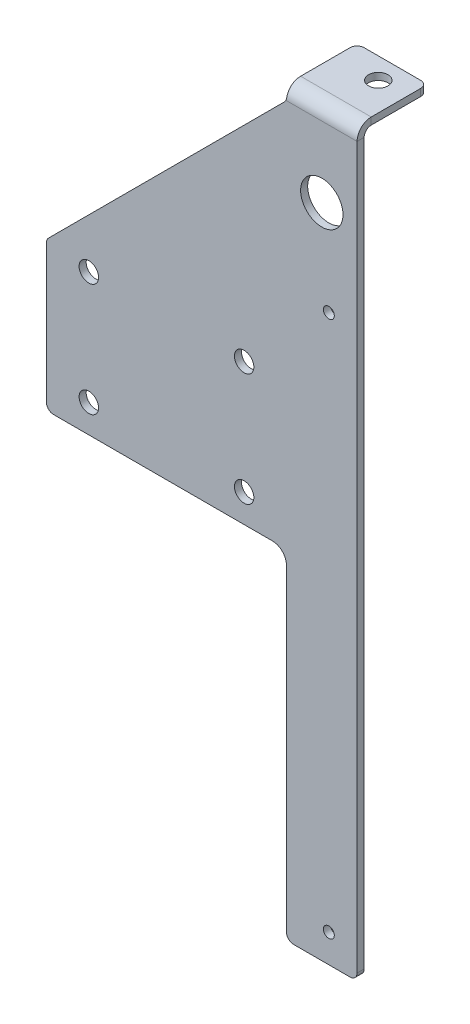
ISO-10303-21;
HEADER;
FILE_DESCRIPTION(('STEP AP214'),'2;1');
FILE_NAME('part.step','',(''),(''),'','','');
FILE_SCHEMA(('AUTOMOTIVE_DESIGN { 1 0 10303 214 1 1 1 1 }'));
ENDSEC;
DATA;
#1=APPLICATION_CONTEXT('core data for automotive mechanical design processes');
#2=APPLICATION_PROTOCOL_DEFINITION('international standard','automotive_design',2000,#1);
#3=PRODUCT_CONTEXT('',#1,'mechanical');
#4=PRODUCT('Part','Part','',(#3));
#5=PRODUCT_RELATED_PRODUCT_CATEGORY('part','',(#4));
#6=PRODUCT_DEFINITION_FORMATION('','',#4);
#7=PRODUCT_DEFINITION_CONTEXT('part definition',#1,'design');
#8=PRODUCT_DEFINITION('design','',#6,#7);
#9=PRODUCT_DEFINITION_SHAPE('','',#8);
#10=(LENGTH_UNIT() NAMED_UNIT(*) SI_UNIT(.MILLI.,.METRE.));
#11=(NAMED_UNIT(*) PLANE_ANGLE_UNIT() SI_UNIT($,.RADIAN.));
#12=(NAMED_UNIT(*) SI_UNIT($,.STERADIAN.) SOLID_ANGLE_UNIT());
#13=UNCERTAINTY_MEASURE_WITH_UNIT(LENGTH_MEASURE(1.E-05),#10,'distance_accuracy_value','');
#14=(GEOMETRIC_REPRESENTATION_CONTEXT(3) GLOBAL_UNCERTAINTY_ASSIGNED_CONTEXT((#13)) GLOBAL_UNIT_ASSIGNED_CONTEXT((#10,
#11,#12)) REPRESENTATION_CONTEXT('',''));
#15=CARTESIAN_POINT('',(0.,0.,0.));
#16=DIRECTION('',(0.,0.,1.));
#17=DIRECTION('',(1.,0.,0.));
#18=AXIS2_PLACEMENT_3D('',#15,#16,#17);
#19=CARTESIAN_POINT('',(31.75,0.,-6.35));
#20=DIRECTION('',(1.,0.,0.));
#21=DIRECTION('',(0.,0.,-1.));
#22=AXIS2_PLACEMENT_3D('',#19,#20,#21);
#23=PLANE('',#22);
#24=DIRECTION('',(0.,-1.,0.));
#25=VECTOR('',#24,1.);
#26=CARTESIAN_POINT('',(31.75,0.,-6.35));
#27=LINE('',#26,#25);
#28=CARTESIAN_POINT('',(31.75,0.,-6.35));
#29=VERTEX_POINT('',#28);
#30=CARTESIAN_POINT('',(31.75,-3.175,-6.35));
#31=VERTEX_POINT('',#30);
#32=EDGE_CURVE('E190',#29,#31,#27,.T.);
#33=ORIENTED_EDGE('',*,*,#32,.F.);
#34=CARTESIAN_POINT('',(31.75,-6.35,-6.35));
#35=DIRECTION('',(-1.,0.,0.));
#36=DIRECTION('',(0.,0.,1.));
#37=AXIS2_PLACEMENT_3D('',#34,#35,#36);
#38=CIRCLE('',#37,6.35);
#39=CARTESIAN_POINT('',(31.75,-6.35,0.));
#40=VERTEX_POINT('',#39);
#41=EDGE_CURVE('E185',#29,#40,#38,.F.);
#42=ORIENTED_EDGE('',*,*,#41,.T.);
#43=DIRECTION('',(0.,0.,1.));
#44=VECTOR('',#43,1.);
#45=CARTESIAN_POINT('',(31.75,-6.35,-3.175));
#46=LINE('',#45,#44);
#47=CARTESIAN_POINT('',(31.75,-6.35,-3.175));
#48=VERTEX_POINT('',#47);
#49=EDGE_CURVE('E181',#48,#40,#46,.T.);
#50=ORIENTED_EDGE('',*,*,#49,.F.);
#51=CARTESIAN_POINT('',(31.75,-6.35,-6.35));
#52=DIRECTION('',(1.,0.,0.));
#53=DIRECTION('',(0.,0.,-1.));
#54=AXIS2_PLACEMENT_3D('',#51,#52,#53);
#55=CIRCLE('',#54,3.175);
#56=EDGE_CURVE('E183',#31,#48,#55,.T.);
#57=ORIENTED_EDGE('',*,*,#56,.F.);
#58=EDGE_LOOP('',(#33,#42,#50,#57));
#59=FACE_BOUND('',#58,.T.);
#60=ADVANCED_FACE('F42',(#59),#23,.T.);
#61=CARTESIAN_POINT('',(31.75,-6.35,-3.175));
#62=DIRECTION('',(1.,0.,0.));
#63=DIRECTION('',(0.,0.,-1.));
#64=AXIS2_PLACEMENT_3D('',#61,#62,#63);
#65=PLANE('',#64);
#66=DIRECTION('',(0.,0.,1.));
#67=VECTOR('',#66,1.);
#68=CARTESIAN_POINT('',(31.75,-3.175,-31.75));
#69=LINE('',#68,#67);
#70=CARTESIAN_POINT('',(31.75,-3.175,-28.575));
#71=VERTEX_POINT('',#70);
#72=EDGE_CURVE('E217',#71,#31,#69,.T.);
#73=ORIENTED_EDGE('',*,*,#72,.F.);
#74=DIRECTION('',(0.,-1.,0.));
#75=VECTOR('',#74,1.);
#76=CARTESIAN_POINT('',(31.75,-6.35,-28.575));
#77=LINE('',#76,#75);
#78=CARTESIAN_POINT('',(31.75,0.,-28.575));
#79=VERTEX_POINT('',#78);
#80=EDGE_CURVE('E322',#71,#79,#77,.F.);
#81=ORIENTED_EDGE('',*,*,#80,.T.);
#82=DIRECTION('',(0.,0.,1.));
#83=VECTOR('',#82,1.);
#84=CARTESIAN_POINT('',(31.75,0.,-31.75));
#85=LINE('',#84,#83);
#86=EDGE_CURVE('E221',#79,#29,#85,.T.);
#87=ORIENTED_EDGE('',*,*,#86,.T.);
#88=ORIENTED_EDGE('',*,*,#32,.T.);
#89=EDGE_LOOP('',(#73,#81,#87,#88));
#90=FACE_BOUND('',#89,.T.);
#91=ADVANCED_FACE('F436',(#90),#65,.T.);
#92=CARTESIAN_POINT('',(0.,-6.35,0.));
#93=DIRECTION('',(-1.,0.,0.));
#94=DIRECTION('',(0.,0.,1.));
#95=AXIS2_PLACEMENT_3D('',#92,#93,#94);
#96=PLANE('',#95);
#97=CARTESIAN_POINT('',(0.,-6.35,-6.35));
#98=DIRECTION('',(1.,0.,0.));
#99=DIRECTION('',(0.,0.,-1.));
#100=AXIS2_PLACEMENT_3D('',#97,#98,#99);
#101=CIRCLE('',#100,3.175);
#102=CARTESIAN_POINT('',(0.,-3.175,-6.35));
#103=VERTEX_POINT('',#102);
#104=CARTESIAN_POINT('',(0.,-5.03487193946543,-3.46017938542985));
#105=VERTEX_POINT('',#104);
#106=EDGE_CURVE('E238',#103,#105,#101,.T.);
#107=ORIENTED_EDGE('',*,*,#106,.T.);
#108=DIRECTION('',(0.,0.,-1.));
#109=VECTOR('',#108,1.);
#110=CARTESIAN_POINT('',(0.,-5.03487193946543,0.));
#111=LINE('',#110,#109);
#112=CARTESIAN_POINT('',(0.,-5.03487193946543,-0.137678518911424));
#113=VERTEX_POINT('',#112);
#114=EDGE_CURVE('E343',#105,#113,#111,.F.);
#115=ORIENTED_EDGE('',*,*,#114,.T.);
#116=CARTESIAN_POINT('',(0.,-6.35,-6.35));
#117=DIRECTION('',(-1.,0.,0.));
#118=DIRECTION('',(0.,0.,1.));
#119=AXIS2_PLACEMENT_3D('',#116,#117,#118);
#120=CIRCLE('',#119,6.35);
#121=CARTESIAN_POINT('',(0.,0.,-6.35));
#122=VERTEX_POINT('',#121);
#123=EDGE_CURVE('E248',#122,#113,#120,.F.);
#124=ORIENTED_EDGE('',*,*,#123,.F.);
#125=DIRECTION('',(0.,1.,0.));
#126=VECTOR('',#125,1.);
#127=CARTESIAN_POINT('',(0.,-3.175,-6.35));
#128=LINE('',#127,#126);
#129=EDGE_CURVE('E191',#103,#122,#128,.T.);
#130=ORIENTED_EDGE('',*,*,#129,.F.);
#131=EDGE_LOOP('',(#107,#115,#124,#130));
#132=FACE_BOUND('',#131,.T.);
#133=ADVANCED_FACE('F432',(#132),#96,.T.);
#134=CARTESIAN_POINT('',(0.,-3.175,-6.35));
#135=DIRECTION('',(-1.,0.,0.));
#136=DIRECTION('',(0.,0.,1.));
#137=AXIS2_PLACEMENT_3D('',#134,#135,#136);
#138=PLANE('',#137);
#139=DIRECTION('',(0.,-1.,0.));
#140=VECTOR('',#139,1.);
#141=CARTESIAN_POINT('',(0.,0.,-3.175));
#142=LINE('',#141,#140);
#143=CARTESIAN_POINT('',(0.,-187.325,-3.17500000000002));
#144=VERTEX_POINT('',#143);
#145=CARTESIAN_POINT('',(0.,-330.2,-3.17500000000004));
#146=VERTEX_POINT('',#145);
#147=EDGE_CURVE('E233',#144,#146,#142,.T.);
#148=ORIENTED_EDGE('',*,*,#147,.T.);
#149=DIRECTION('',(0.,0.,1.));
#150=VECTOR('',#149,1.);
#151=CARTESIAN_POINT('',(0.,-330.2,-6.35));
#152=LINE('',#151,#150);
#153=CARTESIAN_POINT('',(0.,-330.2,0.));
#154=VERTEX_POINT('',#153);
#155=EDGE_CURVE('E379',#146,#154,#152,.T.);
#156=ORIENTED_EDGE('',*,*,#155,.T.);
#157=DIRECTION('',(0.,-1.,0.));
#158=VECTOR('',#157,1.);
#159=CARTESIAN_POINT('',(0.,0.,0.));
#160=LINE('',#159,#158);
#161=CARTESIAN_POINT('',(0.,-187.325,0.));
#162=VERTEX_POINT('',#161);
#163=EDGE_CURVE('E229',#162,#154,#160,.T.);
#164=ORIENTED_EDGE('',*,*,#163,.F.);
#165=DIRECTION('',(0.,0.,1.));
#166=VECTOR('',#165,1.);
#167=CARTESIAN_POINT('',(0.,-187.325,-3.17500000000004));
#168=LINE('',#167,#166);
#169=EDGE_CURVE('E299',#162,#144,#168,.F.);
#170=ORIENTED_EDGE('',*,*,#169,.T.);
#171=EDGE_LOOP('',(#148,#156,#164,#170));
#172=FACE_BOUND('',#171,.T.);
#173=ADVANCED_FACE('F428',(#172),#138,.T.);
#174=CARTESIAN_POINT('',(31.75,0.,0.));
#175=DIRECTION('',(0.,0.,-1.));
#176=DIRECTION('',(0.,1.,0.));
#177=AXIS2_PLACEMENT_3D('',#174,#175,#176);
#178=PLANE('',#177);
#179=CARTESIAN_POINT('',(15.875,-38.1,0.));
#180=DIRECTION('',(0.,0.,1.));
#181=DIRECTION('',(1.,0.,0.));
#182=AXIS2_PLACEMENT_3D('',#179,#180,#181);
#183=CIRCLE('',#182,9.525);
#184=CARTESIAN_POINT('',(25.4,-38.1,0.));
#185=VERTEX_POINT('',#184);
#186=EDGE_CURVE('E543',#185,#185,#183,.T.);
#187=ORIENTED_EDGE('',*,*,#186,.F.);
#188=EDGE_LOOP('',(#187));
#189=FACE_BOUND('',#188,.T.);
#190=CARTESIAN_POINT('',(19.05,-320.675,0.));
#191=DIRECTION('',(0.,0.,1.));
#192=DIRECTION('',(1.,0.,0.));
#193=AXIS2_PLACEMENT_3D('',#190,#191,#192);
#194=CIRCLE('',#193,2.45109999999999);
#195=CARTESIAN_POINT('',(21.5011,-320.675,0.));
#196=VERTEX_POINT('',#195);
#197=EDGE_CURVE('E542',#196,#196,#194,.T.);
#198=ORIENTED_EDGE('',*,*,#197,.F.);
#199=EDGE_LOOP('',(#198));
#200=FACE_BOUND('',#199,.T.);
#201=CARTESIAN_POINT('',(19.05,-79.375,0.));
#202=DIRECTION('',(0.,0.,1.));
#203=DIRECTION('',(1.,0.,0.));
#204=AXIS2_PLACEMENT_3D('',#201,#202,#203);
#205=CIRCLE('',#204,2.4511);
#206=CARTESIAN_POINT('',(21.5011,-79.375,0.));
#207=VERTEX_POINT('',#206);
#208=EDGE_CURVE('E287',#207,#207,#205,.T.);
#209=ORIENTED_EDGE('',*,*,#208,.F.);
#210=EDGE_LOOP('',(#209));
#211=FACE_BOUND('',#210,.T.);
#212=DIRECTION('',(-1.,0.,0.));
#213=VECTOR('',#212,1.);
#214=CARTESIAN_POINT('',(31.75,-333.375,0.));
#215=LINE('',#214,#213);
#216=CARTESIAN_POINT('',(28.575,-333.375,0.));
#217=VERTEX_POINT('',#216);
#218=CARTESIAN_POINT('',(3.175,-333.375,0.));
#219=VERTEX_POINT('',#218);
#220=EDGE_CURVE('E271',#217,#219,#215,.T.);
#221=ORIENTED_EDGE('',*,*,#220,.F.);
#222=CARTESIAN_POINT('',(28.575,-330.2,0.));
#223=DIRECTION('',(0.,0.,-1.));
#224=DIRECTION('',(0.,1.,0.));
#225=AXIS2_PLACEMENT_3D('',#222,#223,#224);
#226=CIRCLE('',#225,3.175);
#227=CARTESIAN_POINT('',(31.75,-330.2,0.));
#228=VERTEX_POINT('',#227);
#229=EDGE_CURVE('E362',#217,#228,#226,.F.);
#230=ORIENTED_EDGE('',*,*,#229,.T.);
#231=DIRECTION('',(0.,-1.,0.));
#232=VECTOR('',#231,1.);
#233=CARTESIAN_POINT('',(31.75,0.,0.));
#234=LINE('',#233,#232);
#235=EDGE_CURVE('E210',#40,#228,#234,.T.);
#236=ORIENTED_EDGE('',*,*,#235,.F.);
#237=DIRECTION('',(-1.,0.,0.));
#238=VECTOR('',#237,1.);
#239=CARTESIAN_POINT('',(31.75,-6.35,0.));
#240=LINE('',#239,#238);
#241=CARTESIAN_POINT('',(-0.285179385429851,-6.35,0.));
#242=VERTEX_POINT('',#241);
#243=EDGE_CURVE('E57',#40,#242,#240,.T.);
#244=ORIENTED_EDGE('',*,*,#243,.T.);
#245=CARTESIAN_POINT('',(-3.175,-5.03487193946543,0.));
#246=DIRECTION('',(0.,0.,-1.));
#247=DIRECTION('',(0.,1.,0.));
#248=AXIS2_PLACEMENT_3D('',#245,#246,#247);
#249=CIRCLE('',#248,3.175);
#250=CARTESIAN_POINT('',(-0.929935969732759,-7.27993596973274,0.));
#251=VERTEX_POINT('',#250);
#252=EDGE_CURVE('E11',#242,#251,#249,.T.);
#253=ORIENTED_EDGE('',*,*,#252,.T.);
#254=DIRECTION('',(-0.707106781186549,-0.707106781186546,0.));
#255=VECTOR('',#254,1.);
#256=CARTESIAN_POINT('',(-107.95,-114.3,0.));
#257=LINE('',#256,#255);
#258=CARTESIAN_POINT('',(-107.020064030267,-113.370064030267,0.));
#259=VERTEX_POINT('',#258);
#260=EDGE_CURVE('E583',#251,#259,#257,.T.);
#261=ORIENTED_EDGE('',*,*,#260,.T.);
#262=CARTESIAN_POINT('',(-104.775,-115.615128060534,0.));
#263=DIRECTION('',(0.,0.,-1.));
#264=DIRECTION('',(0.,1.,0.));
#265=AXIS2_PLACEMENT_3D('',#262,#263,#264);
#266=CIRCLE('',#265,3.175);
#267=CARTESIAN_POINT('',(-107.95,-115.615128060534,0.));
#268=VERTEX_POINT('',#267);
#269=EDGE_CURVE('E356',#259,#268,#266,.F.);
#270=ORIENTED_EDGE('',*,*,#269,.T.);
#271=DIRECTION('',(0.,-1.,0.));
#272=VECTOR('',#271,1.);
#273=CARTESIAN_POINT('',(-107.95,-180.975,0.));
#274=LINE('',#273,#272);
#275=CARTESIAN_POINT('',(-107.95,-177.8,0.));
#276=VERTEX_POINT('',#275);
#277=EDGE_CURVE('E598',#268,#276,#274,.T.);
#278=ORIENTED_EDGE('',*,*,#277,.T.);
#279=CARTESIAN_POINT('',(-104.775,-177.8,0.));
#280=DIRECTION('',(0.,0.,-1.));
#281=DIRECTION('',(0.,1.,0.));
#282=AXIS2_PLACEMENT_3D('',#279,#280,#281);
#283=CIRCLE('',#282,3.175);
#284=CARTESIAN_POINT('',(-104.775,-180.975,0.));
#285=VERTEX_POINT('',#284);
#286=EDGE_CURVE('E353',#276,#285,#283,.F.);
#287=ORIENTED_EDGE('',*,*,#286,.T.);
#288=DIRECTION('',(1.,0.,0.));
#289=VECTOR('',#288,1.);
#290=CARTESIAN_POINT('',(-107.95,-180.975,0.));
#291=LINE('',#290,#289);
#292=CARTESIAN_POINT('',(-6.34999999999999,-180.975,0.));
#293=VERTEX_POINT('',#292);
#294=EDGE_CURVE('E568',#285,#293,#291,.T.);
#295=ORIENTED_EDGE('',*,*,#294,.T.);
#296=CARTESIAN_POINT('',(-6.34999999999999,-187.325,0.));
#297=DIRECTION('',(0.,0.,-1.));
#298=DIRECTION('',(0.,1.,0.));
#299=AXIS2_PLACEMENT_3D('',#296,#297,#298);
#300=CIRCLE('',#299,6.35);
#301=EDGE_CURVE('E302',#293,#162,#300,.T.);
#302=ORIENTED_EDGE('',*,*,#301,.T.);
#303=ORIENTED_EDGE('',*,*,#163,.T.);
#304=CARTESIAN_POINT('',(3.175,-330.2,0.));
#305=DIRECTION('',(0.,0.,-1.));
#306=DIRECTION('',(0.,1.,0.));
#307=AXIS2_PLACEMENT_3D('',#304,#305,#306);
#308=CIRCLE('',#307,3.175);
#309=EDGE_CURVE('E359',#154,#219,#308,.F.);
#310=ORIENTED_EDGE('',*,*,#309,.T.);
#311=EDGE_LOOP('',(#221,#230,#236,#244,#253,#261,#270,#278,#287,#295,#302,#303,#310));
#312=FACE_BOUND('',#311,.T.);
#313=CARTESIAN_POINT('',(-19.05,-168.275,0.));
#314=DIRECTION('',(0.,0.,1.));
#315=DIRECTION('',(1.,0.,0.));
#316=AXIS2_PLACEMENT_3D('',#313,#314,#315);
#317=CIRCLE('',#316,4.3688);
#318=CARTESIAN_POINT('',(-14.6812,-168.275,0.));
#319=VERTEX_POINT('',#318);
#320=EDGE_CURVE('E579',#319,#319,#317,.T.);
#321=ORIENTED_EDGE('',*,*,#320,.F.);
#322=EDGE_LOOP('',(#321));
#323=FACE_BOUND('',#322,.T.);
#324=CARTESIAN_POINT('',(-88.9,-168.275,0.));
#325=DIRECTION('',(0.,0.,1.));
#326=DIRECTION('',(1.,0.,0.));
#327=AXIS2_PLACEMENT_3D('',#324,#325,#326);
#328=CIRCLE('',#327,4.36880000000001);
#329=CARTESIAN_POINT('',(-84.5312,-168.275,0.));
#330=VERTEX_POINT('',#329);
#331=EDGE_CURVE('E584',#330,#330,#328,.T.);
#332=ORIENTED_EDGE('',*,*,#331,.F.);
#333=EDGE_LOOP('',(#332));
#334=FACE_BOUND('',#333,.T.);
#335=CARTESIAN_POINT('',(-19.05,-117.475,0.));
#336=DIRECTION('',(0.,0.,1.));
#337=DIRECTION('',(1.,0.,0.));
#338=AXIS2_PLACEMENT_3D('',#335,#336,#337);
#339=CIRCLE('',#338,4.3688);
#340=CARTESIAN_POINT('',(-14.6812,-117.475,0.));
#341=VERTEX_POINT('',#340);
#342=EDGE_CURVE('E588',#341,#341,#339,.T.);
#343=ORIENTED_EDGE('',*,*,#342,.F.);
#344=EDGE_LOOP('',(#343));
#345=FACE_BOUND('',#344,.T.);
#346=CARTESIAN_POINT('',(-88.9,-117.475,0.));
#347=DIRECTION('',(0.,0.,1.));
#348=DIRECTION('',(1.,0.,0.));
#349=AXIS2_PLACEMENT_3D('',#346,#347,#348);
#350=CIRCLE('',#349,4.36880000000001);
#351=CARTESIAN_POINT('',(-84.5312,-117.475,0.));
#352=VERTEX_POINT('',#351);
#353=EDGE_CURVE('E562',#352,#352,#350,.T.);
#354=ORIENTED_EDGE('',*,*,#353,.F.);
#355=EDGE_LOOP('',(#354));
#356=FACE_BOUND('',#355,.T.);
#357=ADVANCED_FACE('F424',(#189,#200,#211,#312,#323,#334,#345,#356),#178,.F.);
#358=CARTESIAN_POINT('',(31.75,-333.375,-3.17500000000004));
#359=DIRECTION('',(0.,-1.,0.));
#360=DIRECTION('',(0.,0.,-1.));
#361=AXIS2_PLACEMENT_3D('',#358,#359,#360);
#362=PLANE('',#361);
#363=DIRECTION('',(-1.,0.,0.));
#364=VECTOR('',#363,1.);
#365=CARTESIAN_POINT('',(31.75,-333.375,-3.17500000000004));
#366=LINE('',#365,#364);
#367=CARTESIAN_POINT('',(28.575,-333.375,-3.17500000000004));
#368=VERTEX_POINT('',#367);
#369=CARTESIAN_POINT('',(3.175,-333.375,-3.17500000000004));
#370=VERTEX_POINT('',#369);
#371=EDGE_CURVE('E203',#368,#370,#366,.T.);
#372=ORIENTED_EDGE('',*,*,#371,.F.);
#373=DIRECTION('',(0.,0.,1.));
#374=VECTOR('',#373,1.);
#375=CARTESIAN_POINT('',(28.575,-333.375,-3.17500000000004));
#376=LINE('',#375,#374);
#377=EDGE_CURVE('E349',#368,#217,#376,.T.);
#378=ORIENTED_EDGE('',*,*,#377,.T.);
#379=ORIENTED_EDGE('',*,*,#220,.T.);
#380=DIRECTION('',(0.,0.,1.));
#381=VECTOR('',#380,1.);
#382=CARTESIAN_POINT('',(3.175,-333.375,-3.17500000000004));
#383=LINE('',#382,#381);
#384=EDGE_CURVE('E346',#219,#370,#383,.F.);
#385=ORIENTED_EDGE('',*,*,#384,.T.);
#386=EDGE_LOOP('',(#372,#378,#379,#385));
#387=FACE_BOUND('',#386,.T.);
#388=ADVANCED_FACE('F420',(#387),#362,.T.);
#389=CARTESIAN_POINT('',(31.75,0.,-3.175));
#390=DIRECTION('',(0.,0.,-1.));
#391=DIRECTION('',(0.,1.,0.));
#392=AXIS2_PLACEMENT_3D('',#389,#390,#391);
#393=PLANE('',#392);
#394=CARTESIAN_POINT('',(15.875,-38.1,-3.175));
#395=DIRECTION('',(0.,0.,-1.));
#396=DIRECTION('',(0.,1.,0.));
#397=AXIS2_PLACEMENT_3D('',#394,#395,#396);
#398=CIRCLE('',#397,9.525);
#399=CARTESIAN_POINT('',(15.875,-28.575,-3.175));
#400=VERTEX_POINT('',#399);
#401=EDGE_CURVE('E291',#400,#400,#398,.T.);
#402=ORIENTED_EDGE('',*,*,#401,.F.);
#403=EDGE_LOOP('',(#402));
#404=FACE_BOUND('',#403,.T.);
#405=CARTESIAN_POINT('',(19.05,-320.675,-3.17500000000004));
#406=DIRECTION('',(0.,0.,-1.));
#407=DIRECTION('',(0.,1.,0.));
#408=AXIS2_PLACEMENT_3D('',#405,#406,#407);
#409=CIRCLE('',#408,2.45109999999999);
#410=CARTESIAN_POINT('',(19.05,-318.2239,-3.17500000000004));
#411=VERTEX_POINT('',#410);
#412=EDGE_CURVE('E286',#411,#411,#409,.T.);
#413=ORIENTED_EDGE('',*,*,#412,.F.);
#414=EDGE_LOOP('',(#413));
#415=FACE_BOUND('',#414,.T.);
#416=CARTESIAN_POINT('',(19.05,-79.375,-3.17500000000001));
#417=DIRECTION('',(0.,0.,-1.));
#418=DIRECTION('',(0.,1.,0.));
#419=AXIS2_PLACEMENT_3D('',#416,#417,#418);
#420=CIRCLE('',#419,2.4511);
#421=CARTESIAN_POINT('',(19.05,-76.9239,-3.17500000000001));
#422=VERTEX_POINT('',#421);
#423=EDGE_CURVE('E282',#422,#422,#420,.T.);
#424=ORIENTED_EDGE('',*,*,#423,.F.);
#425=EDGE_LOOP('',(#424));
#426=FACE_BOUND('',#425,.T.);
#427=DIRECTION('',(0.,-1.,0.));
#428=VECTOR('',#427,1.);
#429=CARTESIAN_POINT('',(31.75,0.,-3.175));
#430=LINE('',#429,#428);
#431=CARTESIAN_POINT('',(31.75,-330.2,-3.17500000000004));
#432=VERTEX_POINT('',#431);
#433=EDGE_CURVE('E197',#48,#432,#430,.T.);
#434=ORIENTED_EDGE('',*,*,#433,.T.);
#435=CARTESIAN_POINT('',(28.575,-330.2,-3.17500000000004));
#436=DIRECTION('',(0.,0.,-1.));
#437=DIRECTION('',(0.,1.,0.));
#438=AXIS2_PLACEMENT_3D('',#435,#436,#437);
#439=CIRCLE('',#438,3.175);
#440=EDGE_CURVE('E376',#432,#368,#439,.T.);
#441=ORIENTED_EDGE('',*,*,#440,.T.);
#442=ORIENTED_EDGE('',*,*,#371,.T.);
#443=CARTESIAN_POINT('',(3.175,-330.2,-3.17500000000004));
#444=DIRECTION('',(0.,0.,-1.));
#445=DIRECTION('',(0.,1.,0.));
#446=AXIS2_PLACEMENT_3D('',#443,#444,#445);
#447=CIRCLE('',#446,3.175);
#448=EDGE_CURVE('E373',#370,#146,#447,.T.);
#449=ORIENTED_EDGE('',*,*,#448,.T.);
#450=ORIENTED_EDGE('',*,*,#147,.F.);
#451=CARTESIAN_POINT('',(-6.34999999999999,-187.325,-3.17500000000004));
#452=DIRECTION('',(0.,0.,-1.));
#453=DIRECTION('',(0.,1.,0.));
#454=AXIS2_PLACEMENT_3D('',#451,#452,#453);
#455=CIRCLE('',#454,6.35);
#456=CARTESIAN_POINT('',(-6.34999999999999,-180.975,-3.17500000000004));
#457=VERTEX_POINT('',#456);
#458=EDGE_CURVE('E305',#144,#457,#455,.F.);
#459=ORIENTED_EDGE('',*,*,#458,.T.);
#460=DIRECTION('',(1.,0.,0.));
#461=VECTOR('',#460,1.);
#462=CARTESIAN_POINT('',(-107.95,-180.975,-3.17500000000004));
#463=LINE('',#462,#461);
#464=CARTESIAN_POINT('',(-104.775,-180.975,-3.17500000000004));
#465=VERTEX_POINT('',#464);
#466=EDGE_CURVE('E556',#465,#457,#463,.T.);
#467=ORIENTED_EDGE('',*,*,#466,.F.);
#468=CARTESIAN_POINT('',(-104.775,-177.8,-3.17500000000004));
#469=DIRECTION('',(0.,0.,-1.));
#470=DIRECTION('',(0.,1.,0.));
#471=AXIS2_PLACEMENT_3D('',#468,#469,#470);
#472=CIRCLE('',#471,3.175);
#473=CARTESIAN_POINT('',(-107.95,-177.8,-3.17500000000004));
#474=VERTEX_POINT('',#473);
#475=EDGE_CURVE('E367',#465,#474,#472,.T.);
#476=ORIENTED_EDGE('',*,*,#475,.T.);
#477=DIRECTION('',(0.,-1.,0.));
#478=VECTOR('',#477,1.);
#479=CARTESIAN_POINT('',(-107.95,-180.975,-3.17500000000004));
#480=LINE('',#479,#478);
#481=CARTESIAN_POINT('',(-107.95,-115.615128060534,-3.17500000000003));
#482=VERTEX_POINT('',#481);
#483=EDGE_CURVE('E551',#482,#474,#480,.T.);
#484=ORIENTED_EDGE('',*,*,#483,.F.);
#485=CARTESIAN_POINT('',(-104.775,-115.615128060534,-3.17500000000004));
#486=DIRECTION('',(0.,0.,-1.));
#487=DIRECTION('',(0.,1.,0.));
#488=AXIS2_PLACEMENT_3D('',#485,#486,#487);
#489=CIRCLE('',#488,3.175);
#490=CARTESIAN_POINT('',(-107.020064030267,-113.370064030267,-3.17500000000004));
#491=VERTEX_POINT('',#490);
#492=EDGE_CURVE('E370',#482,#491,#489,.T.);
#493=ORIENTED_EDGE('',*,*,#492,.T.);
#494=DIRECTION('',(-0.707106781186549,-0.707106781186546,0.));
#495=VECTOR('',#494,1.);
#496=CARTESIAN_POINT('',(-107.95,-114.3,-3.17500000000004));
#497=LINE('',#496,#495);
#498=CARTESIAN_POINT('',(-0.929935969732718,-7.27993596973273,-3.17500000000003));
#499=VERTEX_POINT('',#498);
#500=EDGE_CURVE('E555',#499,#491,#497,.T.);
#501=ORIENTED_EDGE('',*,*,#500,.F.);
#502=CARTESIAN_POINT('',(-3.175,-5.03487193946543,-3.17500000000001));
#503=DIRECTION('',(0.,0.,-1.));
#504=DIRECTION('',(0.,1.,0.));
#505=AXIS2_PLACEMENT_3D('',#502,#503,#504);
#506=CIRCLE('',#505,3.175);
#507=CARTESIAN_POINT('',(-0.285179385429851,-6.35,-3.175));
#508=VERTEX_POINT('',#507);
#509=EDGE_CURVE('E200',#499,#508,#506,.F.);
#510=ORIENTED_EDGE('',*,*,#509,.T.);
#511=DIRECTION('',(-1.,0.,0.));
#512=VECTOR('',#511,1.);
#513=CARTESIAN_POINT('',(31.75,-6.35,-3.175));
#514=LINE('',#513,#512);
#515=EDGE_CURVE('E65',#48,#508,#514,.T.);
#516=ORIENTED_EDGE('',*,*,#515,.F.);
#517=EDGE_LOOP('',(#434,#441,#442,#449,#450,#459,#467,#476,#484,#493,#501,#510,#516));
#518=FACE_BOUND('',#517,.T.);
#519=CARTESIAN_POINT('',(-19.05,-117.475,-3.17500000000004));
#520=DIRECTION('',(0.,0.,-1.));
#521=DIRECTION('',(0.,1.,0.));
#522=AXIS2_PLACEMENT_3D('',#519,#520,#521);
#523=CIRCLE('',#522,4.3688);
#524=CARTESIAN_POINT('',(-19.05,-113.1062,-3.17500000000004));
#525=VERTEX_POINT('',#524);
#526=EDGE_CURVE('E563',#525,#525,#523,.F.);
#527=ORIENTED_EDGE('',*,*,#526,.T.);
#528=EDGE_LOOP('',(#527));
#529=FACE_BOUND('',#528,.T.);
#530=CARTESIAN_POINT('',(-19.05,-168.275,-3.17500000000004));
#531=DIRECTION('',(0.,0.,-1.));
#532=DIRECTION('',(0.,1.,0.));
#533=AXIS2_PLACEMENT_3D('',#530,#531,#532);
#534=CIRCLE('',#533,4.3688);
#535=CARTESIAN_POINT('',(-19.05,-163.9062,-3.17500000000004));
#536=VERTEX_POINT('',#535);
#537=EDGE_CURVE('E567',#536,#536,#534,.F.);
#538=ORIENTED_EDGE('',*,*,#537,.T.);
#539=EDGE_LOOP('',(#538));
#540=FACE_BOUND('',#539,.T.);
#541=CARTESIAN_POINT('',(-88.9,-168.275,-3.17500000000004));
#542=DIRECTION('',(0.,0.,-1.));
#543=DIRECTION('',(0.,1.,0.));
#544=AXIS2_PLACEMENT_3D('',#541,#542,#543);
#545=CIRCLE('',#544,4.36880000000001);
#546=CARTESIAN_POINT('',(-88.9,-163.9062,-3.17500000000004));
#547=VERTEX_POINT('',#546);
#548=EDGE_CURVE('E572',#547,#547,#545,.F.);
#549=ORIENTED_EDGE('',*,*,#548,.T.);
#550=EDGE_LOOP('',(#549));
#551=FACE_BOUND('',#550,.T.);
#552=CARTESIAN_POINT('',(-88.9,-117.475,-3.17500000000004));
#553=DIRECTION('',(0.,0.,-1.));
#554=DIRECTION('',(0.,1.,0.));
#555=AXIS2_PLACEMENT_3D('',#552,#553,#554);
#556=CIRCLE('',#555,4.36880000000001);
#557=CARTESIAN_POINT('',(-88.9,-113.1062,-3.17500000000004));
#558=VERTEX_POINT('',#557);
#559=EDGE_CURVE('E547',#558,#558,#556,.F.);
#560=ORIENTED_EDGE('',*,*,#559,.T.);
#561=EDGE_LOOP('',(#560));
#562=FACE_BOUND('',#561,.T.);
#563=ADVANCED_FACE('F195',(#404,#415,#426,#518,#529,#540,#551,#562),#393,.T.);
#564=CARTESIAN_POINT('',(31.75,-6.35,-6.35));
#565=DIRECTION('',(-1.,0.,0.));
#566=DIRECTION('',(0.,0.,1.));
#567=AXIS2_PLACEMENT_3D('',#564,#565,#566);
#568=CYLINDRICAL_SURFACE('',#567,3.175);
#569=ORIENTED_EDGE('',*,*,#106,.F.);
#570=DIRECTION('',(-1.,0.,0.));
#571=VECTOR('',#570,1.);
#572=CARTESIAN_POINT('',(31.75,-3.175,-6.35));
#573=LINE('',#572,#571);
#574=EDGE_CURVE('E204',#31,#103,#573,.T.);
#575=ORIENTED_EDGE('',*,*,#574,.F.);
#576=ORIENTED_EDGE('',*,*,#56,.T.);
#577=ORIENTED_EDGE('',*,*,#515,.T.);
#578=CARTESIAN_POINT('',(-0.28517938542985,-6.35,-3.175));
#579=CARTESIAN_POINT('',(-0.257515589266576,-6.28924424737698,-3.17498851669006));
#580=CARTESIAN_POINT('',(-0.231787087807921,-6.22759533212525,-3.17674375477549));
#581=CARTESIAN_POINT('',(-0.18431326261078,-6.10297470846146,-3.18401169265267));
#582=CARTESIAN_POINT('',(-0.162569410744313,-6.04000252078731,-3.18952577737252));
#583=CARTESIAN_POINT('',(-0.12368944960743,-5.9148264866102,-3.20434842258155));
#584=CARTESIAN_POINT('',(-0.106451869260069,-5.85264269966674,-3.21355882810916));
#585=CARTESIAN_POINT('',(-0.0759262594201792,-5.72804143293217,-3.23587063901319));
#586=CARTESIAN_POINT('',(-0.0626368272060468,-5.66562404413659,-3.2489706591488));
#587=CARTESIAN_POINT('',(-0.0339094327120363,-5.50772425205523,-3.28718417310493));
#588=CARTESIAN_POINT('',(-0.0211106821848284,-5.41237536115976,-3.314977810013));
#589=CARTESIAN_POINT('',(-0.00837010650018619,-5.27027585165398,-3.36379680027782));
#590=CARTESIAN_POINT('',(-0.00520139413403253,-5.22260161870243,-3.38146706289946));
#591=CARTESIAN_POINT('',(-0.0010161554027845,-5.12807681087783,-3.41911024000953));
#592=CARTESIAN_POINT('',(4.80953004608709E-07,-5.08122619403186,-3.43908303676246));
#593=CARTESIAN_POINT('',(0.,-5.03487193946543,-3.46017938542985));
#594=B_SPLINE_CURVE_WITH_KNOTS('',3,(#578,#579,#580,#581,#582,#583,#584,#585,#586,#587,#588,
#589,#590,#591,#592,#593),.UNSPECIFIED.,.F.,.F.,(4,2,2,2,2,2,2,4),(0.,0.200231203066913,
0.400536220214967,0.595841153475651,0.791076614425018,1.09051861001913,1.24325893663439,
1.39599145663863),.UNSPECIFIED.);
#595=EDGE_CURVE('E395',#508,#105,#594,.T.);
#596=ORIENTED_EDGE('',*,*,#595,.T.);
#597=EDGE_LOOP('',(#569,#575,#576,#577,#596));
#598=FACE_BOUND('',#597,.T.);
#599=ADVANCED_FACE('F214',(#598),#568,.F.);
#600=CARTESIAN_POINT('',(31.75,-3.175,-31.75));
#601=DIRECTION('',(0.,-1.,0.));
#602=DIRECTION('',(0.,0.,-1.));
#603=AXIS2_PLACEMENT_3D('',#600,#601,#602);
#604=PLANE('',#603);
#605=CARTESIAN_POINT('',(19.05,-3.17499999999998,-22.225));
#606=DIRECTION('',(0.,-1.,0.));
#607=DIRECTION('',(0.,0.,-1.));
#608=AXIS2_PLACEMENT_3D('',#605,#606,#607);
#609=CIRCLE('',#608,4.3688);
#610=CARTESIAN_POINT('',(19.05,-3.17499999999998,-26.5938));
#611=VERTEX_POINT('',#610);
#612=EDGE_CURVE('E234',#611,#611,#609,.T.);
#613=ORIENTED_EDGE('',*,*,#612,.F.);
#614=EDGE_LOOP('',(#613));
#615=FACE_BOUND('',#614,.T.);
#616=DIRECTION('',(-1.,0.,0.));
#617=VECTOR('',#616,1.);
#618=CARTESIAN_POINT('',(31.75,-3.175,-31.75));
#619=LINE('',#618,#617);
#620=CARTESIAN_POINT('',(28.575,-3.175,-31.75));
#621=VERTEX_POINT('',#620);
#622=CARTESIAN_POINT('',(3.175,-3.175,-31.75));
#623=VERTEX_POINT('',#622);
#624=EDGE_CURVE('E262',#621,#623,#619,.T.);
#625=ORIENTED_EDGE('',*,*,#624,.F.);
#626=CARTESIAN_POINT('',(28.575,-3.175,-28.575));
#627=DIRECTION('',(0.,-1.,0.));
#628=DIRECTION('',(0.,0.,-1.));
#629=AXIS2_PLACEMENT_3D('',#626,#627,#628);
#630=CIRCLE('',#629,3.175);
#631=EDGE_CURVE('E319',#621,#71,#630,.T.);
#632=ORIENTED_EDGE('',*,*,#631,.T.);
#633=ORIENTED_EDGE('',*,*,#72,.T.);
#634=ORIENTED_EDGE('',*,*,#574,.T.);
#635=DIRECTION('',(0.,0.,1.));
#636=VECTOR('',#635,1.);
#637=CARTESIAN_POINT('',(0.,-3.175,-31.75));
#638=LINE('',#637,#636);
#639=CARTESIAN_POINT('',(0.,-3.175,-28.575));
#640=VERTEX_POINT('',#639);
#641=EDGE_CURVE('E242',#640,#103,#638,.T.);
#642=ORIENTED_EDGE('',*,*,#641,.F.);
#643=CARTESIAN_POINT('',(3.175,-3.175,-28.575));
#644=DIRECTION('',(0.,-1.,0.));
#645=DIRECTION('',(0.,0.,-1.));
#646=AXIS2_PLACEMENT_3D('',#643,#644,#645);
#647=CIRCLE('',#646,3.175);
#648=EDGE_CURVE('E316',#640,#623,#647,.T.);
#649=ORIENTED_EDGE('',*,*,#648,.T.);
#650=EDGE_LOOP('',(#625,#632,#633,#634,#642,#649));
#651=FACE_BOUND('',#650,.T.);
#652=ADVANCED_FACE('F416',(#615,#651),#604,.T.);
#653=CARTESIAN_POINT('',(31.75,0.,-31.75));
#654=DIRECTION('',(0.,0.,-1.));
#655=DIRECTION('',(-1.,0.,0.));
#656=AXIS2_PLACEMENT_3D('',#653,#654,#655);
#657=PLANE('',#656);
#658=DIRECTION('',(-1.,0.,0.));
#659=VECTOR('',#658,1.);
#660=CARTESIAN_POINT('',(31.75,0.,-31.75));
#661=LINE('',#660,#659);
#662=CARTESIAN_POINT('',(28.575,0.,-31.75));
#663=VERTEX_POINT('',#662);
#664=CARTESIAN_POINT('',(3.175,0.,-31.75));
#665=VERTEX_POINT('',#664);
#666=EDGE_CURVE('E258',#663,#665,#661,.T.);
#667=ORIENTED_EDGE('',*,*,#666,.F.);
#668=DIRECTION('',(0.,-1.,0.));
#669=VECTOR('',#668,1.);
#670=CARTESIAN_POINT('',(28.575,0.,-31.75));
#671=LINE('',#670,#669);
#672=EDGE_CURVE('E312',#663,#621,#671,.T.);
#673=ORIENTED_EDGE('',*,*,#672,.T.);
#674=ORIENTED_EDGE('',*,*,#624,.T.);
#675=DIRECTION('',(0.,-1.,0.));
#676=VECTOR('',#675,1.);
#677=CARTESIAN_POINT('',(3.175,0.,-31.75));
#678=LINE('',#677,#676);
#679=EDGE_CURVE('E309',#623,#665,#678,.F.);
#680=ORIENTED_EDGE('',*,*,#679,.T.);
#681=EDGE_LOOP('',(#667,#673,#674,#680));
#682=FACE_BOUND('',#681,.T.);
#683=ADVANCED_FACE('F694',(#682),#657,.T.);
#684=CARTESIAN_POINT('',(31.75,0.,-31.75));
#685=DIRECTION('',(0.,-1.,0.));
#686=DIRECTION('',(0.,0.,-1.));
#687=AXIS2_PLACEMENT_3D('',#684,#685,#686);
#688=PLANE('',#687);
#689=CARTESIAN_POINT('',(19.05,0.,-22.225));
#690=DIRECTION('',(0.,1.,0.));
#691=DIRECTION('',(0.,0.,1.));
#692=AXIS2_PLACEMENT_3D('',#689,#690,#691);
#693=CIRCLE('',#692,4.3688);
#694=CARTESIAN_POINT('',(19.05,0.,-17.8562));
#695=VERTEX_POINT('',#694);
#696=EDGE_CURVE('E295',#695,#695,#693,.T.);
#697=ORIENTED_EDGE('',*,*,#696,.F.);
#698=EDGE_LOOP('',(#697));
#699=FACE_BOUND('',#698,.T.);
#700=ORIENTED_EDGE('',*,*,#86,.F.);
#701=CARTESIAN_POINT('',(28.575,0.,-28.575));
#702=DIRECTION('',(0.,-1.,0.));
#703=DIRECTION('',(0.,0.,-1.));
#704=AXIS2_PLACEMENT_3D('',#701,#702,#703);
#705=CIRCLE('',#704,3.175);
#706=EDGE_CURVE('E328',#79,#663,#705,.F.);
#707=ORIENTED_EDGE('',*,*,#706,.T.);
#708=ORIENTED_EDGE('',*,*,#666,.T.);
#709=CARTESIAN_POINT('',(3.175,0.,-28.575));
#710=DIRECTION('',(0.,-1.,0.));
#711=DIRECTION('',(0.,0.,-1.));
#712=AXIS2_PLACEMENT_3D('',#709,#710,#711);
#713=CIRCLE('',#712,3.175);
#714=CARTESIAN_POINT('',(0.,0.,-28.575));
#715=VERTEX_POINT('',#714);
#716=EDGE_CURVE('E325',#665,#715,#713,.F.);
#717=ORIENTED_EDGE('',*,*,#716,.T.);
#718=DIRECTION('',(0.,0.,1.));
#719=VECTOR('',#718,1.);
#720=CARTESIAN_POINT('',(0.,0.,-31.75));
#721=LINE('',#720,#719);
#722=EDGE_CURVE('E245',#715,#122,#721,.T.);
#723=ORIENTED_EDGE('',*,*,#722,.T.);
#724=DIRECTION('',(-1.,0.,0.));
#725=VECTOR('',#724,1.);
#726=CARTESIAN_POINT('',(31.75,0.,-6.35));
#727=LINE('',#726,#725);
#728=EDGE_CURVE('E254',#29,#122,#727,.T.);
#729=ORIENTED_EDGE('',*,*,#728,.F.);
#730=EDGE_LOOP('',(#700,#707,#708,#717,#723,#729));
#731=FACE_BOUND('',#730,.T.);
#732=ADVANCED_FACE('F465',(#699,#731),#688,.F.);
#733=CARTESIAN_POINT('',(31.75,-6.35,-6.35));
#734=DIRECTION('',(-1.,0.,0.));
#735=DIRECTION('',(0.,0.,1.));
#736=AXIS2_PLACEMENT_3D('',#733,#734,#735);
#737=CYLINDRICAL_SURFACE('',#736,6.35);
#738=ORIENTED_EDGE('',*,*,#123,.T.);
#739=CARTESIAN_POINT('',(0.,-5.03487193946543,-0.137678518911423));
#740=CARTESIAN_POINT('',(1.36102303101709E-05,-5.11510059984488,-0.120679785648992));
#741=CARTESIAN_POINT('',(-0.00304051871616205,-5.19567127641297,-0.105261208036));
#742=CARTESIAN_POINT('',(-0.0153438529611544,-5.35692197564404,-0.0776047662779082));
#743=CARTESIAN_POINT('',(-0.024595825513953,-5.43760203107793,-0.0653683263040048));
#744=CARTESIAN_POINT('',(-0.0491120733526312,-5.59684893218084,-0.0443199857664173));
#745=CARTESIAN_POINT('',(-0.0642550299701597,-5.67542621532652,-0.0354457004157967));
#746=CARTESIAN_POINT('',(-0.100505752535218,-5.83143833585995,-0.0207246658586943));
#747=CARTESIAN_POINT('',(-0.12161021444132,-5.90887378114427,-0.01487624469913));
#748=CARTESIAN_POINT('',(-0.165036404460008,-6.04726505340572,-0.00691844216243251));
#749=CARTESIAN_POINT('',(-0.186336094473013,-6.10851564169382,-0.00430511809953992));
#750=CARTESIAN_POINT('',(-0.232847698719486,-6.23013094613889,-0.000836703826058971));
#751=CARTESIAN_POINT('',(-0.258089745057585,-6.29048455188114,4.05368206410567E-06));
#752=CARTESIAN_POINT('',(-0.285179385429822,-6.35000000000001,0.));
#753=B_SPLINE_CURVE_WITH_KNOTS('',3,(#739,#740,#741,#742,#743,#744,#745,#746,#747,#748,#749,
#750,#751,#752),.UNSPECIFIED.,.F.,.F.,(4,2,2,2,2,2,4),(0.,0.245967517163871,0.49204492879565,
0.733302183984963,0.974425988781013,1.16898752435018,1.36511631451668),.UNSPECIFIED.);
#754=EDGE_CURVE('E51',#113,#242,#753,.T.);
#755=ORIENTED_EDGE('',*,*,#754,.T.);
#756=ORIENTED_EDGE('',*,*,#243,.F.);
#757=ORIENTED_EDGE('',*,*,#41,.F.);
#758=ORIENTED_EDGE('',*,*,#728,.T.);
#759=EDGE_LOOP('',(#738,#755,#756,#757,#758));
#760=FACE_BOUND('',#759,.T.);
#761=ADVANCED_FACE('F474',(#760),#737,.T.);
#762=CARTESIAN_POINT('',(31.75,-6.35,-6.35));
#763=DIRECTION('',(1.,0.,0.));
#764=DIRECTION('',(0.,0.,-1.));
#765=AXIS2_PLACEMENT_3D('',#762,#763,#764);
#766=PLANE('',#765);
#767=ORIENTED_EDGE('',*,*,#235,.T.);
#768=DIRECTION('',(0.,0.,1.));
#769=VECTOR('',#768,1.);
#770=CARTESIAN_POINT('',(31.75,-330.2,-6.35));
#771=LINE('',#770,#769);
#772=EDGE_CURVE('E208',#228,#432,#771,.F.);
#773=ORIENTED_EDGE('',*,*,#772,.T.);
#774=ORIENTED_EDGE('',*,*,#433,.F.);
#775=ORIENTED_EDGE('',*,*,#49,.T.);
#776=EDGE_LOOP('',(#767,#773,#774,#775));
#777=FACE_BOUND('',#776,.T.);
#778=ADVANCED_FACE('F206',(#777),#766,.T.);
#779=CARTESIAN_POINT('',(0.,-6.35,-6.35));
#780=DIRECTION('',(1.,0.,0.));
#781=DIRECTION('',(0.,0.,-1.));
#782=AXIS2_PLACEMENT_3D('',#779,#780,#781);
#783=PLANE('',#782);
#784=ORIENTED_EDGE('',*,*,#722,.F.);
#785=DIRECTION('',(0.,-1.,0.));
#786=VECTOR('',#785,1.);
#787=CARTESIAN_POINT('',(0.,-3.175,-28.575));
#788=LINE('',#787,#786);
#789=EDGE_CURVE('E331',#715,#640,#788,.T.);
#790=ORIENTED_EDGE('',*,*,#789,.T.);
#791=ORIENTED_EDGE('',*,*,#641,.T.);
#792=ORIENTED_EDGE('',*,*,#129,.T.);
#793=EDGE_LOOP('',(#784,#790,#791,#792));
#794=FACE_BOUND('',#793,.T.);
#795=ADVANCED_FACE('F469',(#794),#783,.F.);
#796=CARTESIAN_POINT('',(19.05,-333.375,-22.225));
#797=DIRECTION('',(0.,1.,0.));
#798=DIRECTION('',(0.,0.,1.));
#799=AXIS2_PLACEMENT_3D('',#796,#797,#798);
#800=CYLINDRICAL_SURFACE('',#799,4.3688);
#801=ORIENTED_EDGE('',*,*,#612,.T.);
#802=EDGE_LOOP('',(#801));
#803=FACE_BOUND('',#802,.T.);
#804=ORIENTED_EDGE('',*,*,#696,.T.);
#805=EDGE_LOOP('',(#804));
#806=FACE_BOUND('',#805,.T.);
#807=ADVANCED_FACE('F682',(#803,#806),#800,.F.);
#808=CARTESIAN_POINT('',(19.05,-79.375,-31.75));
#809=DIRECTION('',(0.,0.,1.));
#810=DIRECTION('',(1.,0.,0.));
#811=AXIS2_PLACEMENT_3D('',#808,#809,#810);
#812=CYLINDRICAL_SURFACE('',#811,2.4511);
#813=ORIENTED_EDGE('',*,*,#423,.T.);
#814=EDGE_LOOP('',(#813));
#815=FACE_BOUND('',#814,.T.);
#816=ORIENTED_EDGE('',*,*,#208,.T.);
#817=EDGE_LOOP('',(#816));
#818=FACE_BOUND('',#817,.T.);
#819=ADVANCED_FACE('F675',(#815,#818),#812,.F.);
#820=CARTESIAN_POINT('',(19.05,-320.675,-31.75));
#821=DIRECTION('',(0.,0.,1.));
#822=DIRECTION('',(1.,0.,0.));
#823=AXIS2_PLACEMENT_3D('',#820,#821,#822);
#824=CYLINDRICAL_SURFACE('',#823,2.45109999999999);
#825=ORIENTED_EDGE('',*,*,#412,.T.);
#826=EDGE_LOOP('',(#825));
#827=FACE_BOUND('',#826,.T.);
#828=ORIENTED_EDGE('',*,*,#197,.T.);
#829=EDGE_LOOP('',(#828));
#830=FACE_BOUND('',#829,.T.);
#831=ADVANCED_FACE('F672',(#827,#830),#824,.F.);
#832=CARTESIAN_POINT('',(15.875,-38.1,-31.75));
#833=DIRECTION('',(0.,0.,1.));
#834=DIRECTION('',(1.,0.,0.));
#835=AXIS2_PLACEMENT_3D('',#832,#833,#834);
#836=CYLINDRICAL_SURFACE('',#835,9.525);
#837=ORIENTED_EDGE('',*,*,#401,.T.);
#838=EDGE_LOOP('',(#837));
#839=FACE_BOUND('',#838,.T.);
#840=ORIENTED_EDGE('',*,*,#186,.T.);
#841=EDGE_LOOP('',(#840));
#842=FACE_BOUND('',#841,.T.);
#843=ADVANCED_FACE('F655',(#839,#842),#836,.F.);
#844=CARTESIAN_POINT('',(-107.95,-180.975,-208.472572136156));
#845=DIRECTION('',(0.,-1.,0.));
#846=DIRECTION('',(1.,0.,0.));
#847=AXIS2_PLACEMENT_3D('',#844,#845,#846);
#848=PLANE('',#847);
#849=ORIENTED_EDGE('',*,*,#294,.F.);
#850=DIRECTION('',(0.,0.,1.));
#851=VECTOR('',#850,1.);
#852=CARTESIAN_POINT('',(-104.775,-180.975,-208.472572136156));
#853=LINE('',#852,#851);
#854=EDGE_CURVE('E390',#285,#465,#853,.F.);
#855=ORIENTED_EDGE('',*,*,#854,.T.);
#856=ORIENTED_EDGE('',*,*,#466,.T.);
#857=DIRECTION('',(0.,0.,1.));
#858=VECTOR('',#857,1.);
#859=CARTESIAN_POINT('',(-6.34999999999999,-180.975,0.));
#860=LINE('',#859,#858);
#861=EDGE_CURVE('E281',#457,#293,#860,.T.);
#862=ORIENTED_EDGE('',*,*,#861,.T.);
#863=EDGE_LOOP('',(#849,#855,#856,#862));
#864=FACE_BOUND('',#863,.T.);
#865=ADVANCED_FACE('F612',(#864),#848,.T.);
#866=CARTESIAN_POINT('',(-107.95,-180.975,-208.472572136156));
#867=DIRECTION('',(-1.,0.,0.));
#868=DIRECTION('',(0.,0.,1.));
#869=AXIS2_PLACEMENT_3D('',#866,#867,#868);
#870=PLANE('',#869);
#871=ORIENTED_EDGE('',*,*,#277,.F.);
#872=DIRECTION('',(0.,0.,1.));
#873=VECTOR('',#872,1.);
#874=CARTESIAN_POINT('',(-107.95,-115.615128060534,-208.472572136156));
#875=LINE('',#874,#873);
#876=EDGE_CURVE('E387',#268,#482,#875,.F.);
#877=ORIENTED_EDGE('',*,*,#876,.T.);
#878=ORIENTED_EDGE('',*,*,#483,.T.);
#879=DIRECTION('',(0.,0.,1.));
#880=VECTOR('',#879,1.);
#881=CARTESIAN_POINT('',(-107.95,-177.8,-208.472572136156));
#882=LINE('',#881,#880);
#883=EDGE_CURVE('E383',#474,#276,#882,.T.);
#884=ORIENTED_EDGE('',*,*,#883,.T.);
#885=EDGE_LOOP('',(#871,#877,#878,#884));
#886=FACE_BOUND('',#885,.T.);
#887=ADVANCED_FACE('F645',(#886),#870,.T.);
#888=CARTESIAN_POINT('',(-107.95,-114.3,-208.472572136156));
#889=DIRECTION('',(-0.707106781186546,0.707106781186549,0.));
#890=DIRECTION('',(-0.707106781186549,-0.707106781186546,0.));
#891=AXIS2_PLACEMENT_3D('',#888,#889,#890);
#892=PLANE('',#891);
#893=ORIENTED_EDGE('',*,*,#260,.F.);
#894=DIRECTION('',(0.,0.,-1.));
#895=VECTOR('',#894,1.);
#896=CARTESIAN_POINT('',(-0.929935969732715,-7.27993596973272,-3.17500000000001));
#897=LINE('',#896,#895);
#898=EDGE_CURVE('E339',#251,#499,#897,.T.);
#899=ORIENTED_EDGE('',*,*,#898,.T.);
#900=ORIENTED_EDGE('',*,*,#500,.T.);
#901=DIRECTION('',(0.,0.,1.));
#902=VECTOR('',#901,1.);
#903=CARTESIAN_POINT('',(-107.020064030267,-113.370064030267,-208.472572136156));
#904=LINE('',#903,#902);
#905=EDGE_CURVE('E335',#491,#259,#904,.T.);
#906=ORIENTED_EDGE('',*,*,#905,.T.);
#907=EDGE_LOOP('',(#893,#899,#900,#906));
#908=FACE_BOUND('',#907,.T.);
#909=ADVANCED_FACE('F642',(#908),#892,.T.);
#910=CARTESIAN_POINT('',(-88.9,-117.475,-208.472572136156));
#911=DIRECTION('',(0.,0.,1.));
#912=DIRECTION('',(1.,0.,0.));
#913=AXIS2_PLACEMENT_3D('',#910,#911,#912);
#914=CYLINDRICAL_SURFACE('',#913,4.36880000000001);
#915=ORIENTED_EDGE('',*,*,#353,.T.);
#916=EDGE_LOOP('',(#915));
#917=FACE_BOUND('',#916,.T.);
#918=ORIENTED_EDGE('',*,*,#559,.F.);
#919=EDGE_LOOP('',(#918));
#920=FACE_BOUND('',#919,.T.);
#921=ADVANCED_FACE('F653',(#917,#920),#914,.F.);
#922=CARTESIAN_POINT('',(-19.05,-117.475,-208.472572136156));
#923=DIRECTION('',(0.,0.,1.));
#924=DIRECTION('',(1.,0.,0.));
#925=AXIS2_PLACEMENT_3D('',#922,#923,#924);
#926=CYLINDRICAL_SURFACE('',#925,4.3688);
#927=ORIENTED_EDGE('',*,*,#342,.T.);
#928=EDGE_LOOP('',(#927));
#929=FACE_BOUND('',#928,.T.);
#930=ORIENTED_EDGE('',*,*,#526,.F.);
#931=EDGE_LOOP('',(#930));
#932=FACE_BOUND('',#931,.T.);
#933=ADVANCED_FACE('F660',(#929,#932),#926,.F.);
#934=CARTESIAN_POINT('',(-88.9,-168.275,-208.472572136156));
#935=DIRECTION('',(0.,0.,1.));
#936=DIRECTION('',(1.,0.,0.));
#937=AXIS2_PLACEMENT_3D('',#934,#935,#936);
#938=CYLINDRICAL_SURFACE('',#937,4.36880000000001);
#939=ORIENTED_EDGE('',*,*,#331,.T.);
#940=EDGE_LOOP('',(#939));
#941=FACE_BOUND('',#940,.T.);
#942=ORIENTED_EDGE('',*,*,#548,.F.);
#943=EDGE_LOOP('',(#942));
#944=FACE_BOUND('',#943,.T.);
#945=ADVANCED_FACE('F664',(#941,#944),#938,.F.);
#946=CARTESIAN_POINT('',(-19.05,-168.275,-208.472572136156));
#947=DIRECTION('',(0.,0.,1.));
#948=DIRECTION('',(1.,0.,0.));
#949=AXIS2_PLACEMENT_3D('',#946,#947,#948);
#950=CYLINDRICAL_SURFACE('',#949,4.3688);
#951=ORIENTED_EDGE('',*,*,#320,.T.);
#952=EDGE_LOOP('',(#951));
#953=FACE_BOUND('',#952,.T.);
#954=ORIENTED_EDGE('',*,*,#537,.F.);
#955=EDGE_LOOP('',(#954));
#956=FACE_BOUND('',#955,.T.);
#957=ADVANCED_FACE('F447',(#953,#956),#950,.F.);
#958=CARTESIAN_POINT('',(-6.34999999999999,-187.325,-208.472572136156));
#959=DIRECTION('',(0.,0.,-1.));
#960=DIRECTION('',(-1.,0.,0.));
#961=AXIS2_PLACEMENT_3D('',#958,#959,#960);
#962=CYLINDRICAL_SURFACE('',#961,6.35);
#963=ORIENTED_EDGE('',*,*,#458,.F.);
#964=ORIENTED_EDGE('',*,*,#169,.F.);
#965=ORIENTED_EDGE('',*,*,#301,.F.);
#966=ORIENTED_EDGE('',*,*,#861,.F.);
#967=EDGE_LOOP('',(#963,#964,#965,#966));
#968=FACE_BOUND('',#967,.T.);
#969=ADVANCED_FACE('F443',(#968),#962,.F.);
#970=CARTESIAN_POINT('',(28.575,0.,-28.575));
#971=DIRECTION('',(0.,-1.,0.));
#972=DIRECTION('',(0.,0.,-1.));
#973=AXIS2_PLACEMENT_3D('',#970,#971,#972);
#974=CYLINDRICAL_SURFACE('',#973,3.175);
#975=ORIENTED_EDGE('',*,*,#706,.F.);
#976=ORIENTED_EDGE('',*,*,#80,.F.);
#977=ORIENTED_EDGE('',*,*,#631,.F.);
#978=ORIENTED_EDGE('',*,*,#672,.F.);
#979=EDGE_LOOP('',(#975,#976,#977,#978));
#980=FACE_BOUND('',#979,.T.);
#981=ADVANCED_FACE('F446',(#980),#974,.T.);
#982=CARTESIAN_POINT('',(3.175,-6.35,-28.575));
#983=DIRECTION('',(0.,1.,0.));
#984=DIRECTION('',(0.,0.,1.));
#985=AXIS2_PLACEMENT_3D('',#982,#983,#984);
#986=CYLINDRICAL_SURFACE('',#985,3.175);
#987=ORIENTED_EDGE('',*,*,#716,.F.);
#988=ORIENTED_EDGE('',*,*,#679,.F.);
#989=ORIENTED_EDGE('',*,*,#648,.F.);
#990=ORIENTED_EDGE('',*,*,#789,.F.);
#991=EDGE_LOOP('',(#987,#988,#989,#990));
#992=FACE_BOUND('',#991,.T.);
#993=ADVANCED_FACE('F450',(#992),#986,.T.);
#994=CARTESIAN_POINT('',(-3.175,-5.03487193946543,-208.472572136156));
#995=DIRECTION('',(0.,0.,1.));
#996=DIRECTION('',(1.,0.,0.));
#997=AXIS2_PLACEMENT_3D('',#994,#995,#996);
#998=CYLINDRICAL_SURFACE('',#997,3.175);
#999=ORIENTED_EDGE('',*,*,#754,.F.);
#1000=ORIENTED_EDGE('',*,*,#114,.F.);
#1001=ORIENTED_EDGE('',*,*,#595,.F.);
#1002=ORIENTED_EDGE('',*,*,#509,.F.);
#1003=ORIENTED_EDGE('',*,*,#898,.F.);
#1004=ORIENTED_EDGE('',*,*,#252,.F.);
#1005=EDGE_LOOP('',(#999,#1000,#1001,#1002,#1003,#1004));
#1006=FACE_BOUND('',#1005,.T.);
#1007=ADVANCED_FACE('F408',(#1006),#998,.F.);
#1008=CARTESIAN_POINT('',(28.575,-330.2,-3.17500000000004));
#1009=DIRECTION('',(0.,0.,1.));
#1010=DIRECTION('',(1.,0.,0.));
#1011=AXIS2_PLACEMENT_3D('',#1008,#1009,#1010);
#1012=CYLINDRICAL_SURFACE('',#1011,3.175);
#1013=ORIENTED_EDGE('',*,*,#440,.F.);
#1014=ORIENTED_EDGE('',*,*,#772,.F.);
#1015=ORIENTED_EDGE('',*,*,#229,.F.);
#1016=ORIENTED_EDGE('',*,*,#377,.F.);
#1017=EDGE_LOOP('',(#1013,#1014,#1015,#1016));
#1018=FACE_BOUND('',#1017,.T.);
#1019=ADVANCED_FACE('F457',(#1018),#1012,.T.);
#1020=CARTESIAN_POINT('',(3.175,-330.2,-6.35));
#1021=DIRECTION('',(0.,0.,1.));
#1022=DIRECTION('',(1.,0.,0.));
#1023=AXIS2_PLACEMENT_3D('',#1020,#1021,#1022);
#1024=CYLINDRICAL_SURFACE('',#1023,3.175);
#1025=ORIENTED_EDGE('',*,*,#448,.F.);
#1026=ORIENTED_EDGE('',*,*,#384,.F.);
#1027=ORIENTED_EDGE('',*,*,#309,.F.);
#1028=ORIENTED_EDGE('',*,*,#155,.F.);
#1029=EDGE_LOOP('',(#1025,#1026,#1027,#1028));
#1030=FACE_BOUND('',#1029,.T.);
#1031=ADVANCED_FACE('F619',(#1030),#1024,.T.);
#1032=CARTESIAN_POINT('',(-104.775,-115.615128060534,-208.472572136156));
#1033=DIRECTION('',(0.,0.,1.));
#1034=DIRECTION('',(1.,0.,0.));
#1035=AXIS2_PLACEMENT_3D('',#1032,#1033,#1034);
#1036=CYLINDRICAL_SURFACE('',#1035,3.175);
#1037=ORIENTED_EDGE('',*,*,#492,.F.);
#1038=ORIENTED_EDGE('',*,*,#876,.F.);
#1039=ORIENTED_EDGE('',*,*,#269,.F.);
#1040=ORIENTED_EDGE('',*,*,#905,.F.);
#1041=EDGE_LOOP('',(#1037,#1038,#1039,#1040));
#1042=FACE_BOUND('',#1041,.T.);
#1043=ADVANCED_FACE('F628',(#1042),#1036,.T.);
#1044=CARTESIAN_POINT('',(-104.775,-177.8,-208.472572136156));
#1045=DIRECTION('',(0.,0.,1.));
#1046=DIRECTION('',(1.,0.,0.));
#1047=AXIS2_PLACEMENT_3D('',#1044,#1045,#1046);
#1048=CYLINDRICAL_SURFACE('',#1047,3.175);
#1049=ORIENTED_EDGE('',*,*,#475,.F.);
#1050=ORIENTED_EDGE('',*,*,#854,.F.);
#1051=ORIENTED_EDGE('',*,*,#286,.F.);
#1052=ORIENTED_EDGE('',*,*,#883,.F.);
#1053=EDGE_LOOP('',(#1049,#1050,#1051,#1052));
#1054=FACE_BOUND('',#1053,.T.);
#1055=ADVANCED_FACE('F44',(#1054),#1048,.T.);
#1056=CLOSED_SHELL('',(#60,#91,#133,#173,#357,#388,#563,#599,#652,#683,#732,#761,#778,#795,#807,
#819,#831,#843,#865,#887,#909,#921,#933,#945,#957,#969,#981,#993,#1007,#1019,#1031,#1043,#1055));
#1057=MANIFOLD_SOLID_BREP('B2',#1056);
#1058=ADVANCED_BREP_SHAPE_REPRESENTATION('',(#18,#1057),#14);
#1059=SHAPE_DEFINITION_REPRESENTATION(#9,#1058);
ENDSEC;
END-ISO-10303-21;
